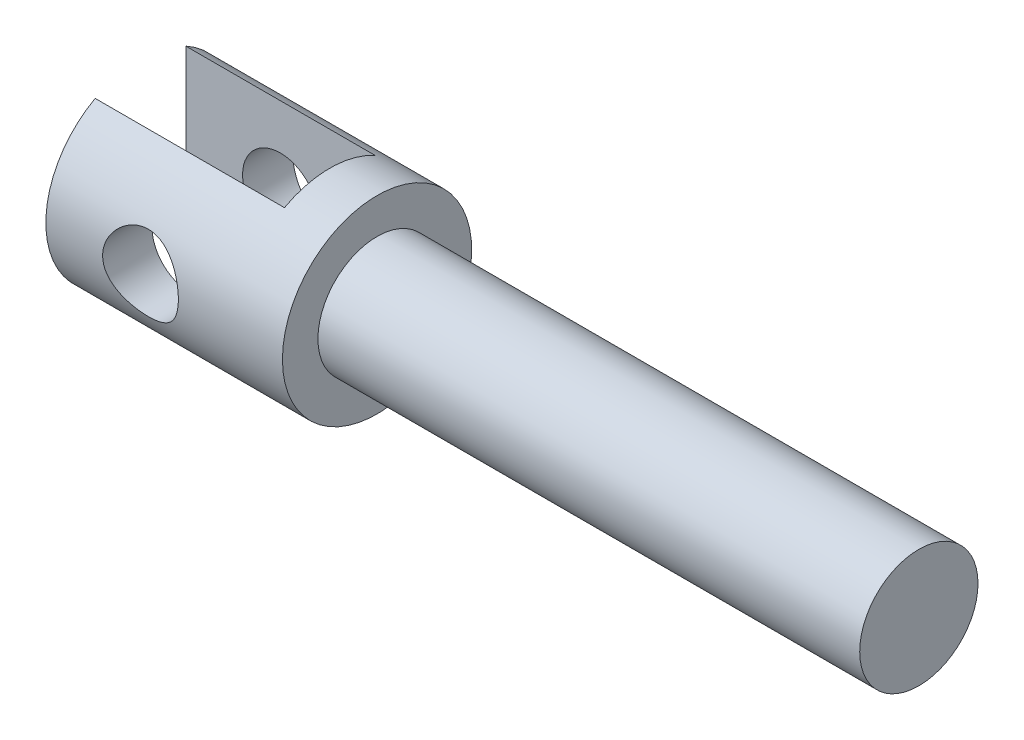
ISO-10303-21;
HEADER;
FILE_DESCRIPTION(('STEP AP214'),'2;1');
FILE_NAME('part.step','',(''),(''),'','','');
FILE_SCHEMA(('AUTOMOTIVE_DESIGN { 1 0 10303 214 1 1 1 1 }'));
ENDSEC;
DATA;
#1=APPLICATION_CONTEXT('core data for automotive mechanical design processes');
#2=APPLICATION_PROTOCOL_DEFINITION('international standard','automotive_design',2000,#1);
#3=PRODUCT_CONTEXT('',#1,'mechanical');
#4=PRODUCT('Part','Part','',(#3));
#5=PRODUCT_RELATED_PRODUCT_CATEGORY('part','',(#4));
#6=PRODUCT_DEFINITION_FORMATION('','',#4);
#7=PRODUCT_DEFINITION_CONTEXT('part definition',#1,'design');
#8=PRODUCT_DEFINITION('design','',#6,#7);
#9=PRODUCT_DEFINITION_SHAPE('','',#8);
#10=(LENGTH_UNIT() NAMED_UNIT(*) SI_UNIT(.MILLI.,.METRE.));
#11=(NAMED_UNIT(*) PLANE_ANGLE_UNIT() SI_UNIT($,.RADIAN.));
#12=(NAMED_UNIT(*) SI_UNIT($,.STERADIAN.) SOLID_ANGLE_UNIT());
#13=UNCERTAINTY_MEASURE_WITH_UNIT(LENGTH_MEASURE(1.E-05),#10,'distance_accuracy_value','');
#14=(GEOMETRIC_REPRESENTATION_CONTEXT(3) GLOBAL_UNCERTAINTY_ASSIGNED_CONTEXT((#13)) GLOBAL_UNIT_ASSIGNED_CONTEXT((#10,
#11,#12)) REPRESENTATION_CONTEXT('',''));
#15=CARTESIAN_POINT('',(0.,0.,0.));
#16=DIRECTION('',(0.,0.,1.));
#17=DIRECTION('',(1.,0.,0.));
#18=AXIS2_PLACEMENT_3D('',#15,#16,#17);
#19=CARTESIAN_POINT('',(-7.4,0.,0.));
#20=DIRECTION('',(-1.,0.,0.));
#21=DIRECTION('',(0.,0.,1.));
#22=AXIS2_PLACEMENT_3D('',#19,#20,#21);
#23=PLANE('',#22);
#24=DIRECTION('',(0.,1.,0.));
#25=VECTOR('',#24,1.);
#26=CARTESIAN_POINT('',(-7.4,0.,0.850900383304026));
#27=LINE('',#26,#25);
#28=CARTESIAN_POINT('',(-7.4,-2.0119957160728,0.850900383304026));
#29=VERTEX_POINT('',#28);
#30=CARTESIAN_POINT('',(-7.4,5.0119957160728,0.850900383304026));
#31=VERTEX_POINT('',#30);
#32=EDGE_CURVE('E95',#29,#31,#27,.T.);
#33=ORIENTED_EDGE('',*,*,#32,.F.);
#34=CARTESIAN_POINT('',(-7.4,1.5,-1.06375000000001));
#35=DIRECTION('',(-1.,0.,0.));
#36=DIRECTION('',(0.,0.,1.));
#37=AXIS2_PLACEMENT_3D('',#34,#35,#36);
#38=CIRCLE('',#37,4.);
#39=EDGE_CURVE('E108',#29,#31,#38,.T.);
#40=ORIENTED_EDGE('',*,*,#39,.T.);
#41=EDGE_LOOP('',(#33,#40));
#42=FACE_BOUND('',#41,.T.);
#43=ADVANCED_FACE('F47',(#42),#23,.T.);
#44=CARTESIAN_POINT('',(34.5,1.5,-1.06375000000001));
#45=DIRECTION('',(-1.,0.,0.));
#46=DIRECTION('',(0.,0.,1.));
#47=AXIS2_PLACEMENT_3D('',#44,#45,#46);
#48=CYLINDRICAL_SURFACE('',#47,2.5);
#49=CARTESIAN_POINT('',(2.6,1.5,-1.06375000000001));
#50=DIRECTION('',(-1.,0.,0.));
#51=DIRECTION('',(0.,0.,1.));
#52=AXIS2_PLACEMENT_3D('',#49,#50,#51);
#53=CIRCLE('',#52,2.5);
#54=CARTESIAN_POINT('',(2.6,1.5,1.43624999999999));
#55=VERTEX_POINT('',#54);
#56=EDGE_CURVE('E96',#55,#55,#53,.F.);
#57=ORIENTED_EDGE('',*,*,#56,.T.);
#58=EDGE_LOOP('',(#57));
#59=FACE_BOUND('',#58,.T.);
#60=CARTESIAN_POINT('',(25.501,1.5,-1.06375000000001));
#61=DIRECTION('',(1.,0.,0.));
#62=DIRECTION('',(0.,0.,-1.));
#63=AXIS2_PLACEMENT_3D('',#60,#61,#62);
#64=CIRCLE('',#63,2.5);
#65=CARTESIAN_POINT('',(25.501,1.5,-3.56375000000001));
#66=VERTEX_POINT('',#65);
#67=EDGE_CURVE('E184',#66,#66,#64,.T.);
#68=ORIENTED_EDGE('',*,*,#67,.F.);
#69=EDGE_LOOP('',(#68));
#70=FACE_BOUND('',#69,.T.);
#71=ADVANCED_FACE('F49',(#59,#70),#48,.T.);
#72=CARTESIAN_POINT('',(-7.4,1.5,-1.06375000000001));
#73=DIRECTION('',(1.,0.,0.));
#74=DIRECTION('',(0.,0.,-1.));
#75=AXIS2_PLACEMENT_3D('',#72,#73,#74);
#76=CYLINDRICAL_SURFACE('',#75,4.);
#77=CARTESIAN_POINT('',(-5.,1.5,-5.06375000000001));
#78=CARTESIAN_POINT('',(-4.99999211854102,1.41400559564569,-5.06374416981669));
#79=CARTESIAN_POINT('',(-4.9930257983293,1.32786194872746,-5.06094435445547));
#80=CARTESIAN_POINT('',(-4.96540183718301,1.15800281566568,-5.05001762480514));
#81=CARTESIAN_POINT('',(-4.94470697673109,1.074294577951,-5.04187622959103));
#82=CARTESIAN_POINT('',(-4.89049913755293,0.912036861818077,-5.02114367370496));
#83=CARTESIAN_POINT('',(-4.85702812302661,0.833471470706432,-5.00856709091259));
#84=CARTESIAN_POINT('',(-4.77838466133876,0.683142423737305,-4.98020288636863));
#85=CARTESIAN_POINT('',(-4.73321627606485,0.611376418599206,-4.96441637966446));
#86=CARTESIAN_POINT('',(-4.63021160115125,0.473199193943685,-4.93039708936336));
#87=CARTESIAN_POINT('',(-4.57191467500779,0.407150181959829,-4.91208837543354));
#88=CARTESIAN_POINT('',(-4.44527999721858,0.285459996172222,-4.87543461524957));
#89=CARTESIAN_POINT('',(-4.37693736223061,0.229823914293173,-4.85708955563035));
#90=CARTESIAN_POINT('',(-4.22845754380619,0.128100346165696,-4.8215323343771));
#91=CARTESIAN_POINT('',(-4.14793081118144,0.082548015043621,-4.80440692771962));
#92=CARTESIAN_POINT('',(-3.97957088126396,0.00579622477028067,-4.77441917749435));
#93=CARTESIAN_POINT('',(-3.89174117772131,-0.0254100514286684,-4.76155480995342));
#94=CARTESIAN_POINT('',(-3.71543013312632,-0.0711190587166945,-4.74236086128656));
#95=CARTESIAN_POINT('',(-3.62715901153903,-0.0863151726445185,-4.73576136284485));
#96=CARTESIAN_POINT('',(-3.44909200135418,-0.101738369312024,-4.72906203239316));
#97=CARTESIAN_POINT('',(-3.35929688429999,-0.101972813050578,-4.72895900418216));
#98=CARTESIAN_POINT('',(-3.18739466283356,-0.0879914940036363,-4.73503400223996));
#99=CARTESIAN_POINT('',(-3.10518742847277,-0.0747802514441101,-4.74077540030761));
#100=CARTESIAN_POINT('',(-2.94427235519463,-0.0359575042382564,-4.7571595008627));
#101=CARTESIAN_POINT('',(-2.86556512951175,-0.0103438358437057,-4.76780305857339));
#102=CARTESIAN_POINT('',(-2.71198573104317,0.0530442139591411,-4.79302588070825));
#103=CARTESIAN_POINT('',(-2.63722460875625,0.0910561101477457,-4.80768103424631));
#104=CARTESIAN_POINT('',(-2.49486734691075,0.177994831414229,-4.83925493111913));
#105=CARTESIAN_POINT('',(-2.42727391247775,0.226925755919325,-4.8561745236548));
#106=CARTESIAN_POINT('',(-2.2956722169584,0.338759520436453,-4.89196389393818));
#107=CARTESIAN_POINT('',(-2.23234501644319,0.402450029623492,-4.91088331980922));
#108=CARTESIAN_POINT('',(-2.11705241759837,0.539748458055846,-4.94742859966627));
#109=CARTESIAN_POINT('',(-2.06508928207176,0.613358347732453,-4.96505419556261));
#110=CARTESIAN_POINT('',(-1.97310604206733,0.770337877915326,-4.9974674501164));
#111=CARTESIAN_POINT('',(-1.93334217504236,0.853871606922818,-5.01219216076333));
#112=CARTESIAN_POINT('',(-1.86866571113755,1.02718098761369,-5.03666862663008));
#113=CARTESIAN_POINT('',(-1.84374556995407,1.11695344252026,-5.04642290769907));
#114=CARTESIAN_POINT('',(-1.81084136366423,1.29448328991374,-5.0593991160553));
#115=CARTESIAN_POINT('',(-1.80194203659715,1.38204536481157,-5.06297356666812));
#116=CARTESIAN_POINT('',(-1.79862951957711,1.55747624784625,-5.06429782808506));
#117=CARTESIAN_POINT('',(-1.80421257476199,1.64534497057914,-5.06204914865834));
#118=CARTESIAN_POINT('',(-1.82903340204159,1.81474619129759,-5.05221053651004));
#119=CARTESIAN_POINT('',(-1.84764638428078,1.89638599342038,-5.0448651307642));
#120=CARTESIAN_POINT('',(-1.89714856664785,2.05530834244862,-5.02582553124401));
#121=CARTESIAN_POINT('',(-1.92803934373494,2.13259032817988,-5.01413077885225));
#122=CARTESIAN_POINT('',(-2.00222795174396,2.28326302865336,-4.9870827581665));
#123=CARTESIAN_POINT('',(-2.04587637763452,2.35646241820432,-4.97162852783844));
#124=CARTESIAN_POINT('',(-2.14395225912451,2.49475487299724,-4.93873691796421));
#125=CARTESIAN_POINT('',(-2.19838403433809,2.5598446726089,-4.92129874488217));
#126=CARTESIAN_POINT('',(-2.3206960103597,2.68457843442305,-4.8849109411049));
#127=CARTESIAN_POINT('',(-2.38922683320496,2.74357914704485,-4.86593753140043));
#128=CARTESIAN_POINT('',(-2.53555206640749,2.84940095793097,-4.82968338333707));
#129=CARTESIAN_POINT('',(-2.61334800027196,2.89622004907001,-4.8124029242121));
#130=CARTESIAN_POINT('',(-2.77716935567528,2.9766460015453,-4.78146439926168));
#131=CARTESIAN_POINT('',(-2.86326719936985,3.01012047562756,-4.76784304707831));
#132=CARTESIAN_POINT('',(-3.04058692137212,3.06183697576424,-4.74633938782346));
#133=CARTESIAN_POINT('',(-3.13180496464994,3.08009024421545,-4.738452845568));
#134=CARTESIAN_POINT('',(-3.30970232141963,3.09977249382272,-4.72992407439942));
#135=CARTESIAN_POINT('',(-3.39623587167468,3.10231766584229,-4.72880136806538));
#136=CARTESIAN_POINT('',(-3.56843588617063,3.09344252742202,-4.73266868826479));
#137=CARTESIAN_POINT('',(-3.65410245912206,3.08202399033103,-4.73765793859836));
#138=CARTESIAN_POINT('',(-3.81866575188403,3.04645709292292,-4.75276319263218));
#139=CARTESIAN_POINT('',(-3.8976962195464,3.02282999485678,-4.76266865461961));
#140=CARTESIAN_POINT('',(-4.05070290369078,2.96400435879281,-4.78634200986158));
#141=CARTESIAN_POINT('',(-4.12467771751986,2.92880262511505,-4.80011096964807));
#142=CARTESIAN_POINT('',(-4.27008769541662,2.84549821020779,-4.83093887683594));
#143=CARTESIAN_POINT('',(-4.34113493610439,2.79677226812759,-4.84814105850595));
#144=CARTESIAN_POINT('',(-4.474394653763,2.6887136954172,-4.88346043497791));
#145=CARTESIAN_POINT('',(-4.53660445770265,2.6293778678545,-4.90157790438726));
#146=CARTESIAN_POINT('',(-4.65456228261089,2.49720440501797,-4.93809853669916));
#147=CARTESIAN_POINT('',(-4.70962984551845,2.42374080091691,-4.95644406369749));
#148=CARTESIAN_POINT('',(-4.80666963409731,2.26792025622862,-4.99015325370975));
#149=CARTESIAN_POINT('',(-4.84863576972202,2.18555920363779,-5.00551552874326));
#150=CARTESIAN_POINT('',(-4.91729777215223,2.01579044999616,-5.0312677185269));
#151=CARTESIAN_POINT('',(-4.94426345884827,1.92850529457576,-5.04174490444023));
#152=CARTESIAN_POINT('',(-4.98291129676341,1.75030123702498,-5.05690444967494));
#153=CARTESIAN_POINT('',(-4.99464194939512,1.65939482068713,-5.06160519596511));
#154=CARTESIAN_POINT('',(-4.99951630478262,1.54552983831274,-5.0635571960331));
#155=CARTESIAN_POINT('',(-5.00000208690335,1.52277015099261,-5.06375154375342));
#156=CARTESIAN_POINT('',(-5.,1.5,-5.06375000000001));
#157=B_SPLINE_CURVE_WITH_KNOTS('',3,(#77,#78,#79,#80,#81,#82,#83,#84,#85,#86,#87,#88,#89,#90,
#91,#92,#93,#94,#95,#96,#97,#98,#99,#100,#101,#102,#103,#104,#105,#106,#107,#108,#109,#110,#111,
#112,#113,#114,#115,#116,#117,#118,#119,#120,#121,#122,#123,#124,#125,#126,#127,#128,#129,#130,
#131,#132,#133,#134,#135,#136,#137,#138,#139,#140,#141,#142,#143,#144,#145,#146,#147,#148,#149,
#150,#151,#152,#153,#154,#155,#156),.UNSPECIFIED.,.T.,.F.,(4,2,2,2,2,2,2,2,2,2,2,2,2,2,2,2,2,2,
2,2,2,2,2,2,2,2,2,2,2,2,2,2,2,2,2,2,2,2,2,4),(0.,0.257922390314457,0.516546908806348,
0.774329165977265,1.03202202854387,1.30077905360318,1.56966715947529,1.85052207055374,
2.13124338494614,2.39923284247063,2.6670904507239,2.91630662721098,3.16556629804838,
3.41991301039053,3.67435537550547,3.94846679349246,4.22263274271786,4.50221530530245,
4.78165564891032,5.04455347622406,5.30738314856066,5.55840364451493,5.80945639195037,
6.0681881071861,6.32702367599175,6.60294779699531,6.87891735234999,7.15756036112662,
7.43599738116747,7.69439738714198,7.95276458050436,8.20091454839015,8.44913308644129,
8.71156374445354,8.97407361078715,9.25360338827069,9.53326290912427,9.80771440810655,
10.0812900192347,10.1495843671744),.UNSPECIFIED.);
#158=CARTESIAN_POINT('',(-5.,1.5,-5.06375000000001));
#159=VERTEX_POINT('',#158);
#160=EDGE_CURVE('E125',#159,#159,#157,.T.);
#161=ORIENTED_EDGE('',*,*,#160,.T.);
#162=EDGE_LOOP('',(#161));
#163=FACE_BOUND('',#162,.T.);
#164=CARTESIAN_POINT('',(-1.8,1.5,2.93624999999999));
#165=CARTESIAN_POINT('',(-1.80000788145898,1.41400559564569,2.93624416981667));
#166=CARTESIAN_POINT('',(-1.8069742016707,1.32786194872746,2.93344435445545));
#167=CARTESIAN_POINT('',(-1.83459816281699,1.15800281566568,2.92251762480512));
#168=CARTESIAN_POINT('',(-1.8552930232689,1.074294577951,2.91437622959101));
#169=CARTESIAN_POINT('',(-1.90950086244706,0.912036861818077,2.89364367370494));
#170=CARTESIAN_POINT('',(-1.94297187697338,0.833471470706432,2.88106709091257));
#171=CARTESIAN_POINT('',(-2.02161533866123,0.683142423737305,2.85270288636862));
#172=CARTESIAN_POINT('',(-2.06678372393514,0.611376418599206,2.83691637966444));
#173=CARTESIAN_POINT('',(-2.16978839884875,0.473199193943685,2.80289708936334));
#174=CARTESIAN_POINT('',(-2.22808532499221,0.407150181959829,2.78458837543351));
#175=CARTESIAN_POINT('',(-2.35472000278142,0.285459996172222,2.74793461524955));
#176=CARTESIAN_POINT('',(-2.42306263776939,0.229823914293173,2.72958955563033));
#177=CARTESIAN_POINT('',(-2.57154245619381,0.128100346165696,2.69403233437708));
#178=CARTESIAN_POINT('',(-2.65206918881856,0.0825480150436212,2.6769069277196));
#179=CARTESIAN_POINT('',(-2.82042911873603,0.0057962247702808,2.64691917749433));
#180=CARTESIAN_POINT('',(-2.90825882227869,-0.0254100514286685,2.6340548099534));
#181=CARTESIAN_POINT('',(-3.08456986687368,-0.0711190587166948,2.61486086128654));
#182=CARTESIAN_POINT('',(-3.17284098846097,-0.0863151726445187,2.60826136284483));
#183=CARTESIAN_POINT('',(-3.35090799864581,-0.101738369312024,2.60156203239314));
#184=CARTESIAN_POINT('',(-3.44070311570001,-0.101972813050579,2.60145900418214));
#185=CARTESIAN_POINT('',(-3.61260533716643,-0.0879914940036364,2.60753400223994));
#186=CARTESIAN_POINT('',(-3.69481257152722,-0.0747802514441102,2.61327540030759));
#187=CARTESIAN_POINT('',(-3.85572764480537,-0.0359575042382562,2.62965950086268));
#188=CARTESIAN_POINT('',(-3.93443487048824,-0.0103438358437053,2.64030305857337));
#189=CARTESIAN_POINT('',(-4.08801426895683,0.0530442139591416,2.66552588070823));
#190=CARTESIAN_POINT('',(-4.16277539124375,0.0910561101477461,2.68018103424629));
#191=CARTESIAN_POINT('',(-4.30513265308925,0.177994831414229,2.71175493111911));
#192=CARTESIAN_POINT('',(-4.37272608752224,0.226925755919325,2.72867452365478));
#193=CARTESIAN_POINT('',(-4.5043277830416,0.338759520436452,2.76446389393816));
#194=CARTESIAN_POINT('',(-4.56765498355681,0.402450029623491,2.7833833198092));
#195=CARTESIAN_POINT('',(-4.68294758240163,0.539748458055845,2.81992859966625));
#196=CARTESIAN_POINT('',(-4.73491071792823,0.613358347732453,2.83755419556259));
#197=CARTESIAN_POINT('',(-4.82689395793266,0.770337877915326,2.86996745011638));
#198=CARTESIAN_POINT('',(-4.86665782495764,0.853871606922818,2.88469216076331));
#199=CARTESIAN_POINT('',(-4.93133428886244,1.02718098761369,2.90916862663006));
#200=CARTESIAN_POINT('',(-4.95625443004593,1.11695344252026,2.91892290769905));
#201=CARTESIAN_POINT('',(-4.98915863633576,1.29448328991374,2.93189911605527));
#202=CARTESIAN_POINT('',(-4.99805796340285,1.38204536481157,2.9354735666681));
#203=CARTESIAN_POINT('',(-5.00137048042289,1.55747624784625,2.93679782808504));
#204=CARTESIAN_POINT('',(-4.99578742523801,1.64534497057914,2.93454914865832));
#205=CARTESIAN_POINT('',(-4.97096659795841,1.81474619129759,2.92471053651002));
#206=CARTESIAN_POINT('',(-4.95235361571922,1.89638599342038,2.91736513076418));
#207=CARTESIAN_POINT('',(-4.90285143335215,2.05530834244862,2.89832553124399));
#208=CARTESIAN_POINT('',(-4.87196065626505,2.13259032817988,2.88663077885223));
#209=CARTESIAN_POINT('',(-4.79777204825604,2.28326302865336,2.85958275816648));
#210=CARTESIAN_POINT('',(-4.75412362236548,2.35646241820432,2.84412852783842));
#211=CARTESIAN_POINT('',(-4.65604774087548,2.49475487299724,2.81123691796419));
#212=CARTESIAN_POINT('',(-4.60161596566191,2.5598446726089,2.79379874488215));
#213=CARTESIAN_POINT('',(-4.4793039896403,2.68457843442305,2.75741094110488));
#214=CARTESIAN_POINT('',(-4.41077316679503,2.74357914704485,2.73843753140041));
#215=CARTESIAN_POINT('',(-4.2644479335925,2.84940095793097,2.70218338333705));
#216=CARTESIAN_POINT('',(-4.18665199972804,2.89622004907001,2.68490292421208));
#217=CARTESIAN_POINT('',(-4.02283064432472,2.9766460015453,2.65396439926166));
#218=CARTESIAN_POINT('',(-3.93673280063015,3.01012047562756,2.64034304707829));
#219=CARTESIAN_POINT('',(-3.75941307862787,3.06183697576424,2.61883938782344));
#220=CARTESIAN_POINT('',(-3.66819503535006,3.08009024421545,2.61095284556798));
#221=CARTESIAN_POINT('',(-3.49029767858036,3.09977249382272,2.6024240743994));
#222=CARTESIAN_POINT('',(-3.40376412832532,3.10231766584229,2.60130136806536));
#223=CARTESIAN_POINT('',(-3.23156411382936,3.09344252742202,2.60516868826477));
#224=CARTESIAN_POINT('',(-3.14589754087793,3.08202399033103,2.61015793859834));
#225=CARTESIAN_POINT('',(-2.98133424811597,3.04645709292292,2.62526319263216));
#226=CARTESIAN_POINT('',(-2.9023037804536,3.02282999485678,2.63516865461959));
#227=CARTESIAN_POINT('',(-2.74929709630921,2.96400435879281,2.65884200986156));
#228=CARTESIAN_POINT('',(-2.67532228248014,2.92880262511505,2.67261096964805));
#229=CARTESIAN_POINT('',(-2.52991230458338,2.84549821020778,2.70343887683592));
#230=CARTESIAN_POINT('',(-2.45886506389561,2.79677226812759,2.72064105850593));
#231=CARTESIAN_POINT('',(-2.32560534623699,2.6887136954172,2.75596043497789));
#232=CARTESIAN_POINT('',(-2.26339554229735,2.6293778678545,2.77407790438724));
#233=CARTESIAN_POINT('',(-2.14543771738911,2.49720440501797,2.81059853669914));
#234=CARTESIAN_POINT('',(-2.09037015448154,2.42374080091691,2.82894406369747));
#235=CARTESIAN_POINT('',(-1.99333036590269,2.26792025622862,2.86265325370972));
#236=CARTESIAN_POINT('',(-1.95136423027798,2.18555920363779,2.87801552874324));
#237=CARTESIAN_POINT('',(-1.88270222784777,2.01579044999616,2.90376771852688));
#238=CARTESIAN_POINT('',(-1.85573654115173,1.92850529457576,2.91424490444021));
#239=CARTESIAN_POINT('',(-1.81708870323658,1.75030123702498,2.92940444967492));
#240=CARTESIAN_POINT('',(-1.80535805060488,1.65939482068713,2.93410519596509));
#241=CARTESIAN_POINT('',(-1.80048369521738,1.54552983831274,2.93605719603308));
#242=CARTESIAN_POINT('',(-1.79999791309664,1.52277015099261,2.9362515437534));
#243=CARTESIAN_POINT('',(-1.8,1.5,2.93624999999999));
#244=B_SPLINE_CURVE_WITH_KNOTS('',3,(#164,#165,#166,#167,#168,#169,#170,#171,#172,#173,#174,
#175,#176,#177,#178,#179,#180,#181,#182,#183,#184,#185,#186,#187,#188,#189,#190,#191,#192,#193,
#194,#195,#196,#197,#198,#199,#200,#201,#202,#203,#204,#205,#206,#207,#208,#209,#210,#211,#212,
#213,#214,#215,#216,#217,#218,#219,#220,#221,#222,#223,#224,#225,#226,#227,#228,#229,#230,#231,
#232,#233,#234,#235,#236,#237,#238,#239,#240,#241,#242,#243),.UNSPECIFIED.,.T.,.F.,(4,2,2,2,2,2,
2,2,2,2,2,2,2,2,2,2,2,2,2,2,2,2,2,2,2,2,2,2,2,2,2,2,2,2,2,2,2,2,2,4),(0.,0.257922390314457,
0.516546908806348,0.774329165977265,1.03202202854387,1.30077905360318,1.56966715947529,
1.85052207055374,2.13124338494614,2.39923284247063,2.6670904507239,2.91630662721098,
3.16556629804838,3.41991301039053,3.67435537550547,3.94846679349246,4.22263274271786,
4.50221530530245,4.78165564891033,5.04455347622406,5.30738314856066,5.55840364451493,
5.80945639195037,6.0681881071861,6.32702367599175,6.60294779699531,6.87891735234999,
7.15756036112662,7.43599738116747,7.69439738714199,7.95276458050437,8.20091454839016,
8.4491330864413,8.71156374445354,8.97407361078715,9.25360338827069,9.53326290912427,
9.80771440810655,10.0812900192347,10.1495843671744),.UNSPECIFIED.);
#245=CARTESIAN_POINT('',(-1.8,1.5,2.93624999999999));
#246=VERTEX_POINT('',#245);
#247=EDGE_CURVE('E137',#246,#246,#244,.T.);
#248=ORIENTED_EDGE('',*,*,#247,.T.);
#249=EDGE_LOOP('',(#248));
#250=FACE_BOUND('',#249,.T.);
#251=CARTESIAN_POINT('',(0.600000000000002,1.5,-1.06375000000001));
#252=DIRECTION('',(-1.,0.,0.));
#253=DIRECTION('',(0.,0.,1.));
#254=AXIS2_PLACEMENT_3D('',#251,#252,#253);
#255=CIRCLE('',#254,4.);
#256=CARTESIAN_POINT('',(0.600000000000002,5.0119957160728,0.850900383304025));
#257=VERTEX_POINT('',#256);
#258=CARTESIAN_POINT('',(0.600000000000002,5.0119957160728,-2.97840038330405));
#259=VERTEX_POINT('',#258);
#260=EDGE_CURVE('E11',#257,#259,#255,.T.);
#261=ORIENTED_EDGE('',*,*,#260,.F.);
#262=DIRECTION('',(1.,0.,0.));
#263=VECTOR('',#262,1.);
#264=CARTESIAN_POINT('',(-7.4,5.0119957160728,0.850900383304026));
#265=LINE('',#264,#263);
#266=EDGE_CURVE('E71',#257,#31,#265,.F.);
#267=ORIENTED_EDGE('',*,*,#266,.T.);
#268=ORIENTED_EDGE('',*,*,#39,.F.);
#269=DIRECTION('',(1.,0.,0.));
#270=VECTOR('',#269,1.);
#271=CARTESIAN_POINT('',(-7.4,-2.0119957160728,0.850900383304026));
#272=LINE('',#271,#270);
#273=CARTESIAN_POINT('',(0.600000000000002,-2.0119957160728,0.850900383304025));
#274=VERTEX_POINT('',#273);
#275=EDGE_CURVE('E116',#29,#274,#272,.T.);
#276=ORIENTED_EDGE('',*,*,#275,.T.);
#277=CARTESIAN_POINT('',(0.600000000000002,-2.0119957160728,-2.97840038330405));
#278=VERTEX_POINT('',#277);
#279=EDGE_CURVE('E56',#278,#274,#255,.T.);
#280=ORIENTED_EDGE('',*,*,#279,.F.);
#281=DIRECTION('',(1.,0.,0.));
#282=VECTOR('',#281,1.);
#283=CARTESIAN_POINT('',(-7.4,-2.0119957160728,-2.97840038330405));
#284=LINE('',#283,#282);
#285=CARTESIAN_POINT('',(-7.4,-2.0119957160728,-2.97840038330405));
#286=VERTEX_POINT('',#285);
#287=EDGE_CURVE('E90',#278,#286,#284,.F.);
#288=ORIENTED_EDGE('',*,*,#287,.T.);
#289=CARTESIAN_POINT('',(-7.4,5.0119957160728,-2.97840038330405));
#290=VERTEX_POINT('',#289);
#291=EDGE_CURVE('E103',#290,#286,#38,.T.);
#292=ORIENTED_EDGE('',*,*,#291,.F.);
#293=DIRECTION('',(1.,0.,0.));
#294=VECTOR('',#293,1.);
#295=CARTESIAN_POINT('',(-7.4,5.0119957160728,-2.97840038330405));
#296=LINE('',#295,#294);
#297=EDGE_CURVE('E63',#290,#259,#296,.T.);
#298=ORIENTED_EDGE('',*,*,#297,.T.);
#299=EDGE_LOOP('',(#261,#267,#268,#276,#280,#288,#292,#298));
#300=FACE_BOUND('',#299,.T.);
#301=CARTESIAN_POINT('',(2.6,1.5,-1.06375000000001));
#302=DIRECTION('',(-1.,0.,0.));
#303=DIRECTION('',(0.,0.,1.));
#304=AXIS2_PLACEMENT_3D('',#301,#302,#303);
#305=CIRCLE('',#304,4.);
#306=CARTESIAN_POINT('',(2.6,1.5,2.93624999999999));
#307=VERTEX_POINT('',#306);
#308=EDGE_CURVE('E113',#307,#307,#305,.T.);
#309=ORIENTED_EDGE('',*,*,#308,.T.);
#310=EDGE_LOOP('',(#309));
#311=FACE_BOUND('',#310,.T.);
#312=ADVANCED_FACE('F101',(#163,#250,#300,#311),#76,.T.);
#313=DIRECTION('',(0.,-1.,0.));
#314=VECTOR('',#313,1.);
#315=CARTESIAN_POINT('',(-7.4,0.,-2.97840038330405));
#316=LINE('',#315,#314);
#317=EDGE_CURVE('E87',#290,#286,#316,.T.);
#318=ORIENTED_EDGE('',*,*,#317,.F.);
#319=ORIENTED_EDGE('',*,*,#291,.T.);
#320=EDGE_LOOP('',(#318,#319));
#321=FACE_BOUND('',#320,.T.);
#322=ADVANCED_FACE('F107',(#321),#23,.T.);
#323=CARTESIAN_POINT('',(2.6,0.,0.));
#324=DIRECTION('',(-1.,0.,0.));
#325=DIRECTION('',(0.,0.,1.));
#326=AXIS2_PLACEMENT_3D('',#323,#324,#325);
#327=PLANE('',#326);
#328=ORIENTED_EDGE('',*,*,#56,.F.);
#329=EDGE_LOOP('',(#328));
#330=FACE_BOUND('',#329,.T.);
#331=ORIENTED_EDGE('',*,*,#308,.F.);
#332=EDGE_LOOP('',(#331));
#333=FACE_BOUND('',#332,.T.);
#334=ADVANCED_FACE('F155',(#330,#333),#327,.F.);
#335=CARTESIAN_POINT('',(0.600000000000002,0.,0.));
#336=DIRECTION('',(-1.,0.,0.));
#337=DIRECTION('',(0.,0.,1.));
#338=AXIS2_PLACEMENT_3D('',#335,#336,#337);
#339=PLANE('',#338);
#340=ORIENTED_EDGE('',*,*,#260,.T.);
#341=DIRECTION('',(0.,-1.,0.));
#342=VECTOR('',#341,1.);
#343=CARTESIAN_POINT('',(0.600000000000002,6.40870098269879,-2.97840038330405));
#344=LINE('',#343,#342);
#345=EDGE_CURVE('E105',#259,#278,#344,.T.);
#346=ORIENTED_EDGE('',*,*,#345,.T.);
#347=ORIENTED_EDGE('',*,*,#279,.T.);
#348=DIRECTION('',(0.,1.,0.));
#349=VECTOR('',#348,1.);
#350=CARTESIAN_POINT('',(0.600000000000002,6.40870098269879,0.850900383304025));
#351=LINE('',#350,#349);
#352=EDGE_CURVE('E122',#274,#257,#351,.T.);
#353=ORIENTED_EDGE('',*,*,#352,.T.);
#354=EDGE_LOOP('',(#340,#346,#347,#353));
#355=FACE_BOUND('',#354,.T.);
#356=ADVANCED_FACE('F121',(#355),#339,.T.);
#357=CARTESIAN_POINT('',(0.600000000000002,6.40870098269879,0.850900383304025));
#358=DIRECTION('',(0.,0.,1.));
#359=DIRECTION('',(1.,0.,0.));
#360=AXIS2_PLACEMENT_3D('',#357,#358,#359);
#361=PLANE('',#360);
#362=CARTESIAN_POINT('',(-3.4,1.5,0.850900383304026));
#363=DIRECTION('',(0.,0.,1.));
#364=DIRECTION('',(1.,0.,0.));
#365=AXIS2_PLACEMENT_3D('',#362,#363,#364);
#366=CIRCLE('',#365,1.6);
#367=CARTESIAN_POINT('',(-1.8,1.5,0.850900383304026));
#368=VERTEX_POINT('',#367);
#369=EDGE_CURVE('E188',#368,#368,#366,.T.);
#370=ORIENTED_EDGE('',*,*,#369,.T.);
#371=EDGE_LOOP('',(#370));
#372=FACE_BOUND('',#371,.T.);
#373=ORIENTED_EDGE('',*,*,#32,.T.);
#374=ORIENTED_EDGE('',*,*,#266,.F.);
#375=ORIENTED_EDGE('',*,*,#352,.F.);
#376=ORIENTED_EDGE('',*,*,#275,.F.);
#377=EDGE_LOOP('',(#373,#374,#375,#376));
#378=FACE_BOUND('',#377,.T.);
#379=ADVANCED_FACE('F123',(#372,#378),#361,.F.);
#380=CARTESIAN_POINT('',(0.600000000000002,6.40870098269879,-2.97840038330405));
#381=DIRECTION('',(0.,0.,-1.));
#382=DIRECTION('',(-1.,0.,0.));
#383=AXIS2_PLACEMENT_3D('',#380,#381,#382);
#384=PLANE('',#383);
#385=CARTESIAN_POINT('',(-3.4,1.5,-2.97840038330405));
#386=DIRECTION('',(0.,0.,-1.));
#387=DIRECTION('',(-1.,0.,0.));
#388=AXIS2_PLACEMENT_3D('',#385,#386,#387);
#389=CIRCLE('',#388,1.6);
#390=CARTESIAN_POINT('',(-5.,1.5,-2.97840038330405));
#391=VERTEX_POINT('',#390);
#392=EDGE_CURVE('E51',#391,#391,#389,.T.);
#393=ORIENTED_EDGE('',*,*,#392,.T.);
#394=EDGE_LOOP('',(#393));
#395=FACE_BOUND('',#394,.T.);
#396=ORIENTED_EDGE('',*,*,#317,.T.);
#397=ORIENTED_EDGE('',*,*,#287,.F.);
#398=ORIENTED_EDGE('',*,*,#345,.F.);
#399=ORIENTED_EDGE('',*,*,#297,.F.);
#400=EDGE_LOOP('',(#396,#397,#398,#399));
#401=FACE_BOUND('',#400,.T.);
#402=ADVANCED_FACE('F89',(#395,#401),#384,.F.);
#403=CARTESIAN_POINT('',(-3.4,1.5,-13.4784003833041));
#404=DIRECTION('',(0.,0.,1.));
#405=DIRECTION('',(1.,0.,0.));
#406=AXIS2_PLACEMENT_3D('',#403,#404,#405);
#407=CYLINDRICAL_SURFACE('',#406,1.6);
#408=ORIENTED_EDGE('',*,*,#392,.F.);
#409=EDGE_LOOP('',(#408));
#410=FACE_BOUND('',#409,.T.);
#411=ORIENTED_EDGE('',*,*,#160,.F.);
#412=EDGE_LOOP('',(#411));
#413=FACE_BOUND('',#412,.T.);
#414=ADVANCED_FACE('F144',(#410,#413),#407,.F.);
#415=ORIENTED_EDGE('',*,*,#369,.F.);
#416=EDGE_LOOP('',(#415));
#417=FACE_BOUND('',#416,.T.);
#418=ORIENTED_EDGE('',*,*,#247,.F.);
#419=EDGE_LOOP('',(#418));
#420=FACE_BOUND('',#419,.T.);
#421=ADVANCED_FACE('F149',(#417,#420),#407,.F.);
#422=CARTESIAN_POINT('',(25.501,1.5,-1.06375000000001));
#423=DIRECTION('',(1.,0.,0.));
#424=DIRECTION('',(0.,0.,-1.));
#425=AXIS2_PLACEMENT_3D('',#422,#423,#424);
#426=PLANE('',#425);
#427=ORIENTED_EDGE('',*,*,#67,.T.);
#428=EDGE_LOOP('',(#427));
#429=FACE_BOUND('',#428,.T.);
#430=ADVANCED_FACE('F151',(#429),#426,.T.);
#431=CLOSED_SHELL('',(#43,#71,#312,#322,#334,#356,#379,#402,#414,#421,#430));
#432=MANIFOLD_SOLID_BREP('B2',#431);
#433=ADVANCED_BREP_SHAPE_REPRESENTATION('',(#18,#432),#14);
#434=SHAPE_DEFINITION_REPRESENTATION(#9,#433);
ENDSEC;
END-ISO-10303-21;
